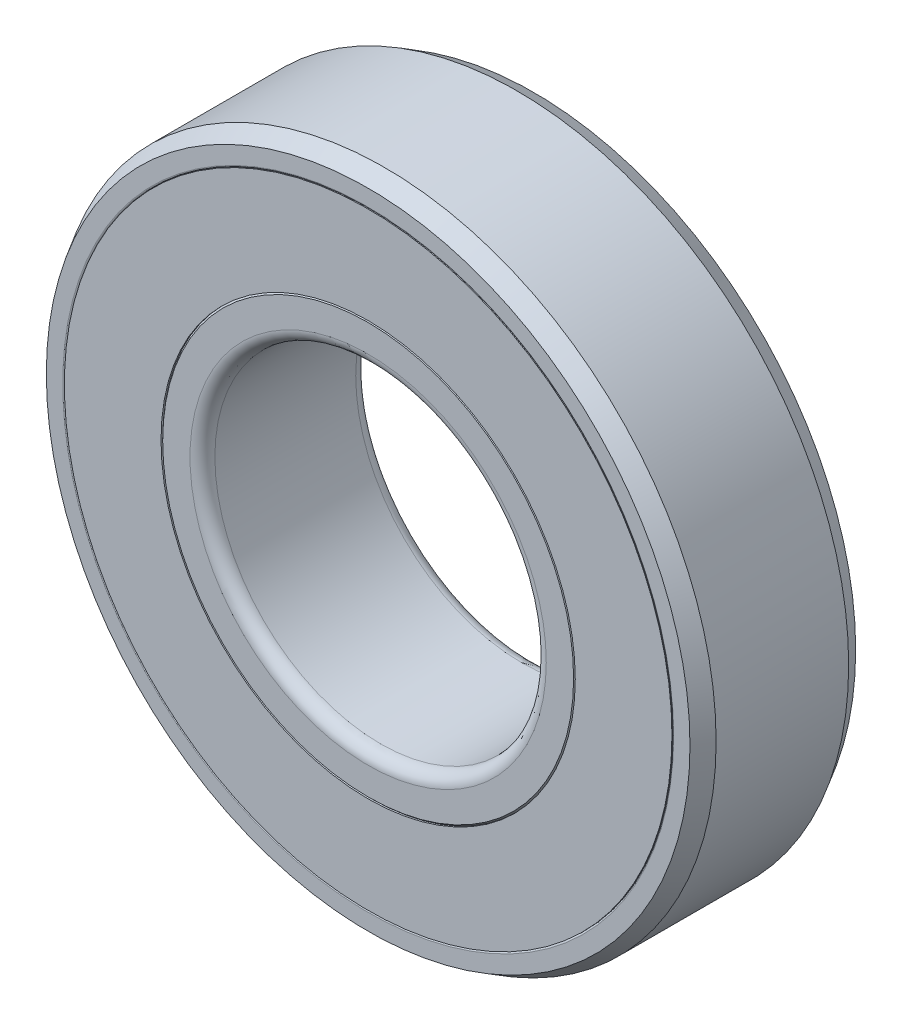
ISO-10303-21;
HEADER;
FILE_DESCRIPTION(('STEP AP214'),'2;1');
FILE_NAME('part.step','',(''),(''),'','','');
FILE_SCHEMA(('AUTOMOTIVE_DESIGN { 1 0 10303 214 1 1 1 1 }'));
ENDSEC;
DATA;
#1=APPLICATION_CONTEXT('core data for automotive mechanical design processes');
#2=APPLICATION_PROTOCOL_DEFINITION('international standard','automotive_design',2000,#1);
#3=PRODUCT_CONTEXT('',#1,'mechanical');
#4=PRODUCT('Part','Part','',(#3));
#5=PRODUCT_RELATED_PRODUCT_CATEGORY('part','',(#4));
#6=PRODUCT_DEFINITION_FORMATION('','',#4);
#7=PRODUCT_DEFINITION_CONTEXT('part definition',#1,'design');
#8=PRODUCT_DEFINITION('design','',#6,#7);
#9=PRODUCT_DEFINITION_SHAPE('','',#8);
#10=(LENGTH_UNIT() NAMED_UNIT(*) SI_UNIT(.MILLI.,.METRE.));
#11=(NAMED_UNIT(*) PLANE_ANGLE_UNIT() SI_UNIT($,.RADIAN.));
#12=(NAMED_UNIT(*) SI_UNIT($,.STERADIAN.) SOLID_ANGLE_UNIT());
#13=UNCERTAINTY_MEASURE_WITH_UNIT(LENGTH_MEASURE(1.E-05),#10,'distance_accuracy_value','');
#14=(GEOMETRIC_REPRESENTATION_CONTEXT(3) GLOBAL_UNCERTAINTY_ASSIGNED_CONTEXT((#13)) GLOBAL_UNIT_ASSIGNED_CONTEXT((#10,
#11,#12)) REPRESENTATION_CONTEXT('',''));
#15=CARTESIAN_POINT('',(0.,0.,0.));
#16=DIRECTION('',(0.,0.,1.));
#17=DIRECTION('',(1.,0.,0.));
#18=AXIS2_PLACEMENT_3D('',#15,#16,#17);
#19=CARTESIAN_POINT('',(4.82129414188614,-3.84485377812892,0.));
#20=DIRECTION('',(-0.781831482468022,0.623489801858743,0.));
#21=DIRECTION('',(0.,0.,1.));
#22=AXIS2_PLACEMENT_3D('',#19,#20,#21);
#23=SPHERICAL_SURFACE('',#22,1.61111111111111);
#24=CARTESIAN_POINT('',(3.56167675346543,-2.84034243068983,0.));
#25=VERTEX_POINT('',#24);
#26=VERTEX_LOOP('',#25);
#27=FACE_BOUND('',#26,.T.);
#28=ADVANCED_FACE('F44',(#27),#23,.T.);
#29=CLOSED_SHELL('',(#28));
#30=MANIFOLD_SOLID_BREP('B2',#29);
#31=CARTESIAN_POINT('',(6.01205545845459,1.37221242606388,0.));
#32=DIRECTION('',(-0.974927912181826,-0.222520933956305,0.));
#33=DIRECTION('',(0.,0.,1.));
#34=AXIS2_PLACEMENT_3D('',#31,#32,#33);
#35=SPHERICAL_SURFACE('',#34,1.61111111111111);
#36=CARTESIAN_POINT('',(4.44133826660609,1.01370647691206,0.));
#37=VERTEX_POINT('',#36);
#38=VERTEX_LOOP('',#37);
#39=FACE_BOUND('',#38,.T.);
#40=ADVANCED_FACE('F61',(#39),#35,.T.);
#41=CLOSED_SHELL('',(#40));
#42=MANIFOLD_SOLID_BREP('B6',#41);
#43=CARTESIAN_POINT('',(2.67561639122499,5.55597468539823,0.));
#44=DIRECTION('',(-0.433883739117565,-0.900968867902416,0.));
#45=DIRECTION('',(0.,0.,1.));
#46=AXIS2_PLACEMENT_3D('',#43,#44,#45);
#47=SPHERICAL_SURFACE('',#46,1.61111111111111);
#48=CARTESIAN_POINT('',(1.97658147820224,4.10441373155545,0.));
#49=VERTEX_POINT('',#48);
#50=VERTEX_LOOP('',#49);
#51=FACE_BOUND('',#50,.T.);
#52=ADVANCED_FACE('F78',(#51),#47,.T.);
#53=CLOSED_SHELL('',(#52));
#54=MANIFOLD_SOLID_BREP('B40',#53);
#55=CARTESIAN_POINT('',(-2.67561639122491,5.55597468539827,0.));
#56=DIRECTION('',(0.433883739117553,-0.900968867902422,0.));
#57=DIRECTION('',(0.,0.,1.));
#58=AXIS2_PLACEMENT_3D('',#55,#56,#57);
#59=SPHERICAL_SURFACE('',#58,1.61111111111111);
#60=CARTESIAN_POINT('',(-1.97658147820218,4.10441373155548,0.));
#61=VERTEX_POINT('',#60);
#62=VERTEX_LOOP('',#61);
#63=FACE_BOUND('',#62,.T.);
#64=ADVANCED_FACE('F95',(#63),#59,.T.);
#65=CLOSED_SHELL('',(#64));
#66=MANIFOLD_SOLID_BREP('B57',#65);
#67=CARTESIAN_POINT('',(-6.01205545845457,1.37221242606396,0.));
#68=DIRECTION('',(0.974927912181823,-0.222520933956318,0.));
#69=DIRECTION('',(0.,0.,1.));
#70=AXIS2_PLACEMENT_3D('',#67,#68,#69);
#71=SPHERICAL_SURFACE('',#70,1.61111111111111);
#72=CARTESIAN_POINT('',(-4.44133826660608,1.01370647691212,0.));
#73=VERTEX_POINT('',#72);
#74=VERTEX_LOOP('',#73);
#75=FACE_BOUND('',#74,.T.);
#76=ADVANCED_FACE('F112',(#75),#71,.T.);
#77=CLOSED_SHELL('',(#76));
#78=MANIFOLD_SOLID_BREP('B74',#77);
#79=CARTESIAN_POINT('',(-4.82129414188619,-3.84485377812885,0.));
#80=DIRECTION('',(0.781831482468031,0.623489801858732,0.));
#81=DIRECTION('',(0.,0.,1.));
#82=AXIS2_PLACEMENT_3D('',#79,#80,#81);
#83=SPHERICAL_SURFACE('',#82,1.61111111111111);
#84=CARTESIAN_POINT('',(-3.56167675346547,-2.84034243068978,0.));
#85=VERTEX_POINT('',#84);
#86=VERTEX_LOOP('',#85);
#87=FACE_BOUND('',#86,.T.);
#88=ADVANCED_FACE('F129',(#87),#83,.T.);
#89=CLOSED_SHELL('',(#88));
#90=MANIFOLD_SOLID_BREP('B91',#89);
#91=CARTESIAN_POINT('',(0.,-6.16666666666667,0.));
#92=DIRECTION('',(0.,1.,0.));
#93=DIRECTION('',(0.,0.,1.));
#94=AXIS2_PLACEMENT_3D('',#91,#92,#93);
#95=SPHERICAL_SURFACE('',#94,1.61111111111111);
#96=CARTESIAN_POINT('',(0.,-4.55555555555556,0.));
#97=VERTEX_POINT('',#96);
#98=VERTEX_LOOP('',#97);
#99=FACE_BOUND('',#98,.T.);
#100=ADVANCED_FACE('F148',(#99),#95,.T.);
#101=CLOSED_SHELL('',(#100));
#102=MANIFOLD_SOLID_BREP('B108',#101);
#103=CARTESIAN_POINT('',(0.,-5.,2.));
#104=DIRECTION('',(0.,0.,1.));
#105=DIRECTION('',(1.,0.,0.));
#106=AXIS2_PLACEMENT_3D('',#103,#104,#105);
#107=PLANE('',#106);
#108=CARTESIAN_POINT('',(0.,0.,2.));
#109=DIRECTION('',(0.,0.,1.));
#110=DIRECTION('',(1.,0.,0.));
#111=AXIS2_PLACEMENT_3D('',#108,#109,#110);
#112=CIRCLE('',#111,7.33333333333333);
#113=CARTESIAN_POINT('',(7.33333333333333,0.,2.));
#114=VERTEX_POINT('',#113);
#115=EDGE_CURVE('E147',#114,#114,#112,.T.);
#116=ORIENTED_EDGE('',*,*,#115,.T.);
#117=EDGE_LOOP('',(#116));
#118=FACE_BOUND('',#117,.T.);
#119=CARTESIAN_POINT('',(0.,0.,2.));
#120=DIRECTION('',(0.,0.,1.));
#121=DIRECTION('',(1.,0.,0.));
#122=AXIS2_PLACEMENT_3D('',#119,#120,#121);
#123=CIRCLE('',#122,5.);
#124=CARTESIAN_POINT('',(5.,0.,2.));
#125=VERTEX_POINT('',#124);
#126=EDGE_CURVE('E181',#125,#125,#123,.T.);
#127=ORIENTED_EDGE('',*,*,#126,.F.);
#128=EDGE_LOOP('',(#127));
#129=FACE_BOUND('',#128,.T.);
#130=ADVANCED_FACE('F167',(#118,#129),#107,.T.);
#131=CARTESIAN_POINT('',(0.,0.,2.));
#132=DIRECTION('',(0.,0.,1.));
#133=DIRECTION('',(1.,0.,0.));
#134=AXIS2_PLACEMENT_3D('',#131,#132,#133);
#135=CYLINDRICAL_SURFACE('',#134,7.33333333333333);
#136=CARTESIAN_POINT('',(0.,0.,1.70833333333333));
#137=DIRECTION('',(0.,0.,1.));
#138=DIRECTION('',(1.,0.,0.));
#139=AXIS2_PLACEMENT_3D('',#136,#137,#138);
#140=CIRCLE('',#139,7.33333333333333);
#141=CARTESIAN_POINT('',(7.33333333333333,0.,1.70833333333333));
#142=VERTEX_POINT('',#141);
#143=EDGE_CURVE('E173',#142,#142,#140,.T.);
#144=ORIENTED_EDGE('',*,*,#143,.T.);
#145=EDGE_LOOP('',(#144));
#146=FACE_BOUND('',#145,.T.);
#147=ORIENTED_EDGE('',*,*,#115,.F.);
#148=EDGE_LOOP('',(#147));
#149=FACE_BOUND('',#148,.T.);
#150=ADVANCED_FACE('F191',(#146,#149),#135,.T.);
#151=CARTESIAN_POINT('',(0.,-5.,1.70833333333333));
#152=DIRECTION('',(0.,0.,-1.));
#153=DIRECTION('',(-1.,0.,0.));
#154=AXIS2_PLACEMENT_3D('',#151,#152,#153);
#155=PLANE('',#154);
#156=CARTESIAN_POINT('',(0.,0.,1.70833333333333));
#157=DIRECTION('',(0.,0.,1.));
#158=DIRECTION('',(1.,0.,0.));
#159=AXIS2_PLACEMENT_3D('',#156,#157,#158);
#160=CIRCLE('',#159,5.);
#161=CARTESIAN_POINT('',(5.,0.,1.70833333333333));
#162=VERTEX_POINT('',#161);
#163=EDGE_CURVE('E177',#162,#162,#160,.T.);
#164=ORIENTED_EDGE('',*,*,#163,.T.);
#165=EDGE_LOOP('',(#164));
#166=FACE_BOUND('',#165,.T.);
#167=ORIENTED_EDGE('',*,*,#143,.F.);
#168=EDGE_LOOP('',(#167));
#169=FACE_BOUND('',#168,.T.);
#170=ADVANCED_FACE('F195',(#166,#169),#155,.T.);
#171=CARTESIAN_POINT('',(0.,0.,2.));
#172=DIRECTION('',(0.,0.,1.));
#173=DIRECTION('',(1.,0.,0.));
#174=AXIS2_PLACEMENT_3D('',#171,#172,#173);
#175=CYLINDRICAL_SURFACE('',#174,5.);
#176=ORIENTED_EDGE('',*,*,#126,.T.);
#177=EDGE_LOOP('',(#176));
#178=FACE_BOUND('',#177,.T.);
#179=ORIENTED_EDGE('',*,*,#163,.F.);
#180=EDGE_LOOP('',(#179));
#181=FACE_BOUND('',#180,.T.);
#182=ADVANCED_FACE('F187',(#178,#181),#175,.F.);
#183=CLOSED_SHELL('',(#130,#150,#170,#182));
#184=MANIFOLD_SOLID_BREP('B125',#183);
#185=CARTESIAN_POINT('',(0.,0.,1.7));
#186=DIRECTION('',(0.,0.,1.));
#187=DIRECTION('',(1.,0.,0.));
#188=AXIS2_PLACEMENT_3D('',#185,#186,#187);
#189=TOROIDAL_SURFACE('',#188,4.3,0.3);
#190=CARTESIAN_POINT('',(0.,0.,2.));
#191=DIRECTION('',(0.,0.,1.));
#192=DIRECTION('',(1.,0.,0.));
#193=AXIS2_PLACEMENT_3D('',#190,#191,#192);
#194=CIRCLE('',#193,4.3);
#195=CARTESIAN_POINT('',(4.3,0.,2.));
#196=VERTEX_POINT('',#195);
#197=EDGE_CURVE('E166',#196,#196,#194,.T.);
#198=ORIENTED_EDGE('',*,*,#197,.T.);
#199=EDGE_LOOP('',(#198));
#200=FACE_BOUND('',#199,.T.);
#201=CARTESIAN_POINT('',(0.,0.,1.7));
#202=DIRECTION('',(0.,0.,1.));
#203=DIRECTION('',(1.,0.,0.));
#204=AXIS2_PLACEMENT_3D('',#201,#202,#203);
#205=CIRCLE('',#204,4.);
#206=CARTESIAN_POINT('',(4.,0.,1.7));
#207=VERTEX_POINT('',#206);
#208=EDGE_CURVE('E262',#207,#207,#205,.T.);
#209=ORIENTED_EDGE('',*,*,#208,.F.);
#210=EDGE_LOOP('',(#209));
#211=FACE_BOUND('',#210,.T.);
#212=ADVANCED_FACE('F228',(#200,#211),#189,.T.);
#213=CARTESIAN_POINT('',(0.,-4.96,2.));
#214=DIRECTION('',(0.,0.,1.));
#215=DIRECTION('',(1.,0.,0.));
#216=AXIS2_PLACEMENT_3D('',#213,#214,#215);
#217=PLANE('',#216);
#218=CARTESIAN_POINT('',(0.,0.,2.));
#219=DIRECTION('',(0.,0.,1.));
#220=DIRECTION('',(1.,0.,0.));
#221=AXIS2_PLACEMENT_3D('',#218,#219,#220);
#222=CIRCLE('',#221,4.96);
#223=CARTESIAN_POINT('',(4.96,0.,2.));
#224=VERTEX_POINT('',#223);
#225=EDGE_CURVE('E234',#224,#224,#222,.T.);
#226=ORIENTED_EDGE('',*,*,#225,.T.);
#227=EDGE_LOOP('',(#226));
#228=FACE_BOUND('',#227,.T.);
#229=ORIENTED_EDGE('',*,*,#197,.F.);
#230=EDGE_LOOP('',(#229));
#231=FACE_BOUND('',#230,.T.);
#232=ADVANCED_FACE('F270',(#228,#231),#217,.T.);
#233=CARTESIAN_POINT('',(0.,0.,2.));
#234=DIRECTION('',(0.,0.,-1.));
#235=DIRECTION('',(-1.,0.,0.));
#236=AXIS2_PLACEMENT_3D('',#233,#234,#235);
#237=CONICAL_SURFACE('',#236,4.96,0.785398163397443);
#238=CARTESIAN_POINT('',(0.,0.,1.96));
#239=DIRECTION('',(0.,0.,1.));
#240=DIRECTION('',(1.,0.,0.));
#241=AXIS2_PLACEMENT_3D('',#238,#239,#240);
#242=CIRCLE('',#241,5.);
#243=CARTESIAN_POINT('',(5.,0.,1.96));
#244=VERTEX_POINT('',#243);
#245=EDGE_CURVE('E238',#244,#244,#242,.T.);
#246=ORIENTED_EDGE('',*,*,#245,.T.);
#247=EDGE_LOOP('',(#246));
#248=FACE_BOUND('',#247,.T.);
#249=ORIENTED_EDGE('',*,*,#225,.F.);
#250=EDGE_LOOP('',(#249));
#251=FACE_BOUND('',#250,.T.);
#252=ADVANCED_FACE('F274',(#248,#251),#237,.T.);
#253=CARTESIAN_POINT('',(0.,0.,2.));
#254=DIRECTION('',(0.,0.,1.));
#255=DIRECTION('',(1.,0.,0.));
#256=AXIS2_PLACEMENT_3D('',#253,#254,#255);
#257=CYLINDRICAL_SURFACE('',#256,5.);
#258=CARTESIAN_POINT('',(0.,0.,1.11111111111111));
#259=DIRECTION('',(0.,0.,1.));
#260=DIRECTION('',(1.,0.,0.));
#261=AXIS2_PLACEMENT_3D('',#258,#259,#260);
#262=CIRCLE('',#261,5.);
#263=CARTESIAN_POINT('',(5.,0.,1.11111111111111));
#264=VERTEX_POINT('',#263);
#265=EDGE_CURVE('E242',#264,#264,#262,.T.);
#266=ORIENTED_EDGE('',*,*,#265,.T.);
#267=EDGE_LOOP('',(#266));
#268=FACE_BOUND('',#267,.T.);
#269=ORIENTED_EDGE('',*,*,#245,.F.);
#270=EDGE_LOOP('',(#269));
#271=FACE_BOUND('',#270,.T.);
#272=ADVANCED_FACE('F278',(#268,#271),#257,.T.);
#273=CARTESIAN_POINT('',(0.,0.,0.));
#274=DIRECTION('',(0.,0.,1.));
#275=DIRECTION('',(1.,0.,0.));
#276=AXIS2_PLACEMENT_3D('',#273,#274,#275);
#277=TOROIDAL_SURFACE('',#276,6.16666666666667,1.61111111111111);
#278=CARTESIAN_POINT('',(0.,0.,-1.11111111111111));
#279=DIRECTION('',(0.,0.,1.));
#280=DIRECTION('',(1.,0.,0.));
#281=AXIS2_PLACEMENT_3D('',#278,#279,#280);
#282=CIRCLE('',#281,5.);
#283=CARTESIAN_POINT('',(5.,0.,-1.11111111111111));
#284=VERTEX_POINT('',#283);
#285=EDGE_CURVE('E247',#284,#284,#282,.T.);
#286=ORIENTED_EDGE('',*,*,#285,.T.);
#287=EDGE_LOOP('',(#286));
#288=FACE_BOUND('',#287,.T.);
#289=ORIENTED_EDGE('',*,*,#265,.F.);
#290=EDGE_LOOP('',(#289));
#291=FACE_BOUND('',#290,.T.);
#292=ADVANCED_FACE('F285',(#288,#291),#277,.F.);
#293=CARTESIAN_POINT('',(0.,0.,2.));
#294=DIRECTION('',(0.,0.,1.));
#295=DIRECTION('',(1.,0.,0.));
#296=AXIS2_PLACEMENT_3D('',#293,#294,#295);
#297=CYLINDRICAL_SURFACE('',#296,5.);
#298=CARTESIAN_POINT('',(0.,0.,-1.96));
#299=DIRECTION('',(0.,0.,1.));
#300=DIRECTION('',(1.,0.,0.));
#301=AXIS2_PLACEMENT_3D('',#298,#299,#300);
#302=CIRCLE('',#301,5.);
#303=CARTESIAN_POINT('',(5.,0.,-1.96));
#304=VERTEX_POINT('',#303);
#305=EDGE_CURVE('E250',#304,#304,#302,.T.);
#306=ORIENTED_EDGE('',*,*,#305,.T.);
#307=EDGE_LOOP('',(#306));
#308=FACE_BOUND('',#307,.T.);
#309=ORIENTED_EDGE('',*,*,#285,.F.);
#310=EDGE_LOOP('',(#309));
#311=FACE_BOUND('',#310,.T.);
#312=ADVANCED_FACE('F289',(#308,#311),#297,.T.);
#313=CARTESIAN_POINT('',(0.,0.,-1.96));
#314=DIRECTION('',(0.,0.,1.));
#315=DIRECTION('',(1.,0.,0.));
#316=AXIS2_PLACEMENT_3D('',#313,#314,#315);
#317=CONICAL_SURFACE('',#316,5.,0.785398163397448);
#318=CARTESIAN_POINT('',(0.,0.,-2.));
#319=DIRECTION('',(0.,0.,1.));
#320=DIRECTION('',(1.,0.,0.));
#321=AXIS2_PLACEMENT_3D('',#318,#319,#320);
#322=CIRCLE('',#321,4.96);
#323=CARTESIAN_POINT('',(4.96,0.,-2.));
#324=VERTEX_POINT('',#323);
#325=EDGE_CURVE('E253',#324,#324,#322,.T.);
#326=ORIENTED_EDGE('',*,*,#325,.T.);
#327=EDGE_LOOP('',(#326));
#328=FACE_BOUND('',#327,.T.);
#329=ORIENTED_EDGE('',*,*,#305,.F.);
#330=EDGE_LOOP('',(#329));
#331=FACE_BOUND('',#330,.T.);
#332=ADVANCED_FACE('F293',(#328,#331),#317,.T.);
#333=CARTESIAN_POINT('',(0.,-4.96,-2.));
#334=DIRECTION('',(0.,0.,-1.));
#335=DIRECTION('',(-1.,0.,0.));
#336=AXIS2_PLACEMENT_3D('',#333,#334,#335);
#337=PLANE('',#336);
#338=CARTESIAN_POINT('',(0.,0.,-2.));
#339=DIRECTION('',(0.,0.,1.));
#340=DIRECTION('',(1.,0.,0.));
#341=AXIS2_PLACEMENT_3D('',#338,#339,#340);
#342=CIRCLE('',#341,4.3);
#343=CARTESIAN_POINT('',(4.3,0.,-2.));
#344=VERTEX_POINT('',#343);
#345=EDGE_CURVE('E256',#344,#344,#342,.T.);
#346=ORIENTED_EDGE('',*,*,#345,.T.);
#347=EDGE_LOOP('',(#346));
#348=FACE_BOUND('',#347,.T.);
#349=ORIENTED_EDGE('',*,*,#325,.F.);
#350=EDGE_LOOP('',(#349));
#351=FACE_BOUND('',#350,.T.);
#352=ADVANCED_FACE('F297',(#348,#351),#337,.T.);
#353=CARTESIAN_POINT('',(0.,0.,-1.7));
#354=DIRECTION('',(0.,0.,1.));
#355=DIRECTION('',(1.,0.,0.));
#356=AXIS2_PLACEMENT_3D('',#353,#354,#355);
#357=TOROIDAL_SURFACE('',#356,4.3,0.3);
#358=CARTESIAN_POINT('',(0.,0.,-1.7));
#359=DIRECTION('',(0.,0.,1.));
#360=DIRECTION('',(1.,0.,0.));
#361=AXIS2_PLACEMENT_3D('',#358,#359,#360);
#362=CIRCLE('',#361,4.);
#363=CARTESIAN_POINT('',(4.,0.,-1.7));
#364=VERTEX_POINT('',#363);
#365=EDGE_CURVE('E259',#364,#364,#362,.T.);
#366=ORIENTED_EDGE('',*,*,#365,.T.);
#367=EDGE_LOOP('',(#366));
#368=FACE_BOUND('',#367,.T.);
#369=ORIENTED_EDGE('',*,*,#345,.F.);
#370=EDGE_LOOP('',(#369));
#371=FACE_BOUND('',#370,.T.);
#372=ADVANCED_FACE('F301',(#368,#371),#357,.T.);
#373=CARTESIAN_POINT('',(0.,0.,2.));
#374=DIRECTION('',(0.,0.,1.));
#375=DIRECTION('',(1.,0.,0.));
#376=AXIS2_PLACEMENT_3D('',#373,#374,#375);
#377=CYLINDRICAL_SURFACE('',#376,4.);
#378=ORIENTED_EDGE('',*,*,#208,.T.);
#379=EDGE_LOOP('',(#378));
#380=FACE_BOUND('',#379,.T.);
#381=ORIENTED_EDGE('',*,*,#365,.F.);
#382=EDGE_LOOP('',(#381));
#383=FACE_BOUND('',#382,.T.);
#384=ADVANCED_FACE('F266',(#380,#383),#377,.F.);
#385=CLOSED_SHELL('',(#212,#232,#252,#272,#292,#312,#332,#352,#372,#384));
#386=MANIFOLD_SOLID_BREP('B142',#385);
#387=CARTESIAN_POINT('',(0.,0.,2.));
#388=DIRECTION('',(0.,0.,-1.));
#389=DIRECTION('',(-1.,0.,0.));
#390=AXIS2_PLACEMENT_3D('',#387,#388,#389);
#391=CONICAL_SURFACE('',#390,7.76905989232416,0.523598775598282);
#392=CARTESIAN_POINT('',(0.,0.,1.6));
#393=DIRECTION('',(0.,0.,1.));
#394=DIRECTION('',(1.,0.,0.));
#395=AXIS2_PLACEMENT_3D('',#392,#393,#394);
#396=CIRCLE('',#395,8.);
#397=CARTESIAN_POINT('',(8.,0.,1.6));
#398=VERTEX_POINT('',#397);
#399=EDGE_CURVE('E227',#398,#398,#396,.T.);
#400=ORIENTED_EDGE('',*,*,#399,.T.);
#401=EDGE_LOOP('',(#400));
#402=FACE_BOUND('',#401,.T.);
#403=CARTESIAN_POINT('',(0.,0.,2.));
#404=DIRECTION('',(0.,0.,1.));
#405=DIRECTION('',(1.,0.,0.));
#406=AXIS2_PLACEMENT_3D('',#403,#404,#405);
#407=CIRCLE('',#406,7.76905989232416);
#408=CARTESIAN_POINT('',(7.76905989232416,0.,2.));
#409=VERTEX_POINT('',#408);
#410=EDGE_CURVE('E394',#409,#409,#407,.T.);
#411=ORIENTED_EDGE('',*,*,#410,.F.);
#412=EDGE_LOOP('',(#411));
#413=FACE_BOUND('',#412,.T.);
#414=ADVANCED_FACE('F360',(#402,#413),#391,.T.);
#415=CARTESIAN_POINT('',(0.,0.,2.));
#416=DIRECTION('',(0.,0.,1.));
#417=DIRECTION('',(1.,0.,0.));
#418=AXIS2_PLACEMENT_3D('',#415,#416,#417);
#419=CYLINDRICAL_SURFACE('',#418,8.);
#420=CARTESIAN_POINT('',(0.,0.,-1.6));
#421=DIRECTION('',(0.,0.,1.));
#422=DIRECTION('',(1.,0.,0.));
#423=AXIS2_PLACEMENT_3D('',#420,#421,#422);
#424=CIRCLE('',#423,8.);
#425=CARTESIAN_POINT('',(8.,0.,-1.6));
#426=VERTEX_POINT('',#425);
#427=EDGE_CURVE('E366',#426,#426,#424,.T.);
#428=ORIENTED_EDGE('',*,*,#427,.T.);
#429=EDGE_LOOP('',(#428));
#430=FACE_BOUND('',#429,.T.);
#431=ORIENTED_EDGE('',*,*,#399,.F.);
#432=EDGE_LOOP('',(#431));
#433=FACE_BOUND('',#432,.T.);
#434=ADVANCED_FACE('F402',(#430,#433),#419,.T.);
#435=CARTESIAN_POINT('',(0.,0.,-1.6));
#436=DIRECTION('',(0.,0.,1.));
#437=DIRECTION('',(1.,0.,0.));
#438=AXIS2_PLACEMENT_3D('',#435,#436,#437);
#439=CONICAL_SURFACE('',#438,8.,0.523598775598281);
#440=CARTESIAN_POINT('',(0.,0.,-2.));
#441=DIRECTION('',(0.,0.,1.));
#442=DIRECTION('',(1.,0.,0.));
#443=AXIS2_PLACEMENT_3D('',#440,#441,#442);
#444=CIRCLE('',#443,7.76905989232416);
#445=CARTESIAN_POINT('',(7.76905989232416,0.,-2.));
#446=VERTEX_POINT('',#445);
#447=EDGE_CURVE('E370',#446,#446,#444,.T.);
#448=ORIENTED_EDGE('',*,*,#447,.T.);
#449=EDGE_LOOP('',(#448));
#450=FACE_BOUND('',#449,.T.);
#451=ORIENTED_EDGE('',*,*,#427,.F.);
#452=EDGE_LOOP('',(#451));
#453=FACE_BOUND('',#452,.T.);
#454=ADVANCED_FACE('F406',(#450,#453),#439,.T.);
#455=CARTESIAN_POINT('',(0.,-7.37333333333333,-2.));
#456=DIRECTION('',(0.,0.,-1.));
#457=DIRECTION('',(-1.,0.,0.));
#458=AXIS2_PLACEMENT_3D('',#455,#456,#457);
#459=PLANE('',#458);
#460=CARTESIAN_POINT('',(0.,0.,-2.));
#461=DIRECTION('',(0.,0.,1.));
#462=DIRECTION('',(1.,0.,0.));
#463=AXIS2_PLACEMENT_3D('',#460,#461,#462);
#464=CIRCLE('',#463,7.37333333333333);
#465=CARTESIAN_POINT('',(7.37333333333333,0.,-2.));
#466=VERTEX_POINT('',#465);
#467=EDGE_CURVE('E374',#466,#466,#464,.T.);
#468=ORIENTED_EDGE('',*,*,#467,.T.);
#469=EDGE_LOOP('',(#468));
#470=FACE_BOUND('',#469,.T.);
#471=ORIENTED_EDGE('',*,*,#447,.F.);
#472=EDGE_LOOP('',(#471));
#473=FACE_BOUND('',#472,.T.);
#474=ADVANCED_FACE('F410',(#470,#473),#459,.T.);
#475=CARTESIAN_POINT('',(0.,0.,-1.96));
#476=DIRECTION('',(0.,0.,1.));
#477=DIRECTION('',(1.,0.,0.));
#478=AXIS2_PLACEMENT_3D('',#475,#476,#477);
#479=TOROIDAL_SURFACE('',#478,7.37333333333333,0.0399999999999995);
#480=CARTESIAN_POINT('',(0.,0.,-1.96));
#481=DIRECTION('',(0.,0.,1.));
#482=DIRECTION('',(1.,0.,0.));
#483=AXIS2_PLACEMENT_3D('',#480,#481,#482);
#484=CIRCLE('',#483,7.33333333333333);
#485=CARTESIAN_POINT('',(7.33333333333333,0.,-1.96));
#486=VERTEX_POINT('',#485);
#487=EDGE_CURVE('E379',#486,#486,#484,.T.);
#488=ORIENTED_EDGE('',*,*,#487,.T.);
#489=EDGE_LOOP('',(#488));
#490=FACE_BOUND('',#489,.T.);
#491=ORIENTED_EDGE('',*,*,#467,.F.);
#492=EDGE_LOOP('',(#491));
#493=FACE_BOUND('',#492,.T.);
#494=ADVANCED_FACE('F417',(#490,#493),#479,.T.);
#495=CARTESIAN_POINT('',(0.,0.,2.));
#496=DIRECTION('',(0.,0.,1.));
#497=DIRECTION('',(1.,0.,0.));
#498=AXIS2_PLACEMENT_3D('',#495,#496,#497);
#499=CYLINDRICAL_SURFACE('',#498,7.33333333333333);
#500=CARTESIAN_POINT('',(0.,0.,-1.11111111111111));
#501=DIRECTION('',(0.,0.,1.));
#502=DIRECTION('',(1.,0.,0.));
#503=AXIS2_PLACEMENT_3D('',#500,#501,#502);
#504=CIRCLE('',#503,7.33333333333333);
#505=CARTESIAN_POINT('',(7.33333333333333,0.,-1.11111111111111));
#506=VERTEX_POINT('',#505);
#507=EDGE_CURVE('E382',#506,#506,#504,.T.);
#508=ORIENTED_EDGE('',*,*,#507,.T.);
#509=EDGE_LOOP('',(#508));
#510=FACE_BOUND('',#509,.T.);
#511=ORIENTED_EDGE('',*,*,#487,.F.);
#512=EDGE_LOOP('',(#511));
#513=FACE_BOUND('',#512,.T.);
#514=ADVANCED_FACE('F421',(#510,#513),#499,.F.);
#515=CARTESIAN_POINT('',(0.,0.,0.));
#516=DIRECTION('',(0.,0.,1.));
#517=DIRECTION('',(1.,0.,0.));
#518=AXIS2_PLACEMENT_3D('',#515,#516,#517);
#519=TOROIDAL_SURFACE('',#518,6.16666666666667,1.61111111111111);
#520=CARTESIAN_POINT('',(0.,0.,1.11111111111111));
#521=DIRECTION('',(0.,0.,1.));
#522=DIRECTION('',(1.,0.,0.));
#523=AXIS2_PLACEMENT_3D('',#520,#521,#522);
#524=CIRCLE('',#523,7.33333333333333);
#525=CARTESIAN_POINT('',(7.33333333333333,0.,1.11111111111111));
#526=VERTEX_POINT('',#525);
#527=EDGE_CURVE('E385',#526,#526,#524,.T.);
#528=ORIENTED_EDGE('',*,*,#527,.T.);
#529=EDGE_LOOP('',(#528));
#530=FACE_BOUND('',#529,.T.);
#531=ORIENTED_EDGE('',*,*,#507,.F.);
#532=EDGE_LOOP('',(#531));
#533=FACE_BOUND('',#532,.T.);
#534=ADVANCED_FACE('F425',(#530,#533),#519,.F.);
#535=CARTESIAN_POINT('',(0.,0.,2.));
#536=DIRECTION('',(0.,0.,1.));
#537=DIRECTION('',(1.,0.,0.));
#538=AXIS2_PLACEMENT_3D('',#535,#536,#537);
#539=CYLINDRICAL_SURFACE('',#538,7.33333333333333);
#540=CARTESIAN_POINT('',(0.,0.,1.96));
#541=DIRECTION('',(0.,0.,1.));
#542=DIRECTION('',(1.,0.,0.));
#543=AXIS2_PLACEMENT_3D('',#540,#541,#542);
#544=CIRCLE('',#543,7.33333333333333);
#545=CARTESIAN_POINT('',(7.33333333333333,0.,1.96));
#546=VERTEX_POINT('',#545);
#547=EDGE_CURVE('E388',#546,#546,#544,.T.);
#548=ORIENTED_EDGE('',*,*,#547,.T.);
#549=EDGE_LOOP('',(#548));
#550=FACE_BOUND('',#549,.T.);
#551=ORIENTED_EDGE('',*,*,#527,.F.);
#552=EDGE_LOOP('',(#551));
#553=FACE_BOUND('',#552,.T.);
#554=ADVANCED_FACE('F429',(#550,#553),#539,.F.);
#555=CARTESIAN_POINT('',(0.,0.,1.96));
#556=DIRECTION('',(0.,0.,1.));
#557=DIRECTION('',(1.,0.,0.));
#558=AXIS2_PLACEMENT_3D('',#555,#556,#557);
#559=TOROIDAL_SURFACE('',#558,7.37333333333333,0.0399999999999995);
#560=CARTESIAN_POINT('',(0.,0.,2.));
#561=DIRECTION('',(0.,0.,1.));
#562=DIRECTION('',(1.,0.,0.));
#563=AXIS2_PLACEMENT_3D('',#560,#561,#562);
#564=CIRCLE('',#563,7.37333333333333);
#565=CARTESIAN_POINT('',(7.37333333333333,0.,2.));
#566=VERTEX_POINT('',#565);
#567=EDGE_CURVE('E391',#566,#566,#564,.T.);
#568=ORIENTED_EDGE('',*,*,#567,.T.);
#569=EDGE_LOOP('',(#568));
#570=FACE_BOUND('',#569,.T.);
#571=ORIENTED_EDGE('',*,*,#547,.F.);
#572=EDGE_LOOP('',(#571));
#573=FACE_BOUND('',#572,.T.);
#574=ADVANCED_FACE('F433',(#570,#573),#559,.T.);
#575=CARTESIAN_POINT('',(0.,-7.37333333333333,2.));
#576=DIRECTION('',(0.,0.,1.));
#577=DIRECTION('',(1.,0.,0.));
#578=AXIS2_PLACEMENT_3D('',#575,#576,#577);
#579=PLANE('',#578);
#580=ORIENTED_EDGE('',*,*,#410,.T.);
#581=EDGE_LOOP('',(#580));
#582=FACE_BOUND('',#581,.T.);
#583=ORIENTED_EDGE('',*,*,#567,.F.);
#584=EDGE_LOOP('',(#583));
#585=FACE_BOUND('',#584,.T.);
#586=ADVANCED_FACE('F398',(#582,#585),#579,.T.);
#587=CLOSED_SHELL('',(#414,#434,#454,#474,#494,#514,#534,#554,#574,#586));
#588=MANIFOLD_SOLID_BREP('B161',#587);
#589=ADVANCED_BREP_SHAPE_REPRESENTATION('',(#18,#30,#42,#54,#66,#78,#90,#102,#184,#386,#588),#14);
#590=SHAPE_DEFINITION_REPRESENTATION(#9,#589);
ENDSEC;
END-ISO-10303-21;
